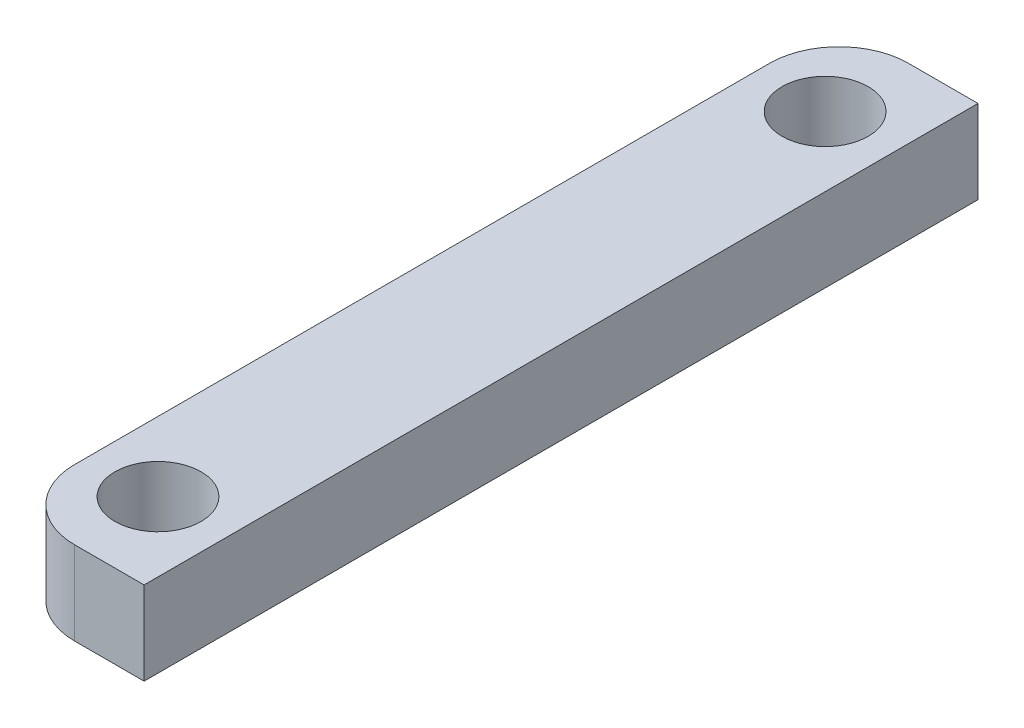
ISO-10303-21;
HEADER;
FILE_DESCRIPTION(('STEP AP214'),'2;1');
FILE_NAME('part.step','',(''),(''),'','','');
FILE_SCHEMA(('AUTOMOTIVE_DESIGN { 1 0 10303 214 1 1 1 1 }'));
ENDSEC;
DATA;
#1=APPLICATION_CONTEXT('core data for automotive mechanical design processes');
#2=APPLICATION_PROTOCOL_DEFINITION('international standard','automotive_design',2000,#1);
#3=PRODUCT_CONTEXT('',#1,'mechanical');
#4=PRODUCT('Part','Part','',(#3));
#5=PRODUCT_RELATED_PRODUCT_CATEGORY('part','',(#4));
#6=PRODUCT_DEFINITION_FORMATION('','',#4);
#7=PRODUCT_DEFINITION_CONTEXT('part definition',#1,'design');
#8=PRODUCT_DEFINITION('design','',#6,#7);
#9=PRODUCT_DEFINITION_SHAPE('','',#8);
#10=(LENGTH_UNIT() NAMED_UNIT(*) SI_UNIT(.MILLI.,.METRE.));
#11=(NAMED_UNIT(*) PLANE_ANGLE_UNIT() SI_UNIT($,.RADIAN.));
#12=(NAMED_UNIT(*) SI_UNIT($,.STERADIAN.) SOLID_ANGLE_UNIT());
#13=UNCERTAINTY_MEASURE_WITH_UNIT(LENGTH_MEASURE(1.E-05),#10,'distance_accuracy_value','');
#14=(GEOMETRIC_REPRESENTATION_CONTEXT(3) GLOBAL_UNCERTAINTY_ASSIGNED_CONTEXT((#13)) GLOBAL_UNIT_ASSIGNED_CONTEXT((#10,
#11,#12)) REPRESENTATION_CONTEXT('',''));
#15=CARTESIAN_POINT('',(0.,0.,0.));
#16=DIRECTION('',(0.,0.,1.));
#17=DIRECTION('',(1.,0.,0.));
#18=AXIS2_PLACEMENT_3D('',#15,#16,#17);
#19=CARTESIAN_POINT('',(0.,3.,0.));
#20=DIRECTION('',(0.,-1.,0.));
#21=DIRECTION('',(0.,0.,-1.));
#22=AXIS2_PLACEMENT_3D('',#19,#20,#21);
#23=PLANE('',#22);
#24=DIRECTION('',(0.,0.,1.));
#25=VECTOR('',#24,1.);
#26=CARTESIAN_POINT('',(-2.5,3.,15.));
#27=LINE('',#26,#25);
#28=CARTESIAN_POINT('',(-2.5,3.,-12.5));
#29=VERTEX_POINT('',#28);
#30=CARTESIAN_POINT('',(-2.5,3.,12.5));
#31=VERTEX_POINT('',#30);
#32=EDGE_CURVE('E93',#29,#31,#27,.T.);
#33=ORIENTED_EDGE('',*,*,#32,.T.);
#34=CARTESIAN_POINT('',(0.,3.,12.5));
#35=DIRECTION('',(0.,-1.,0.));
#36=DIRECTION('',(0.,0.,-1.));
#37=AXIS2_PLACEMENT_3D('',#34,#35,#36);
#38=CIRCLE('',#37,2.5);
#39=CARTESIAN_POINT('',(0.,3.,15.));
#40=VERTEX_POINT('',#39);
#41=EDGE_CURVE('E41',#31,#40,#38,.F.);
#42=ORIENTED_EDGE('',*,*,#41,.T.);
#43=DIRECTION('',(1.,0.,0.));
#44=VECTOR('',#43,1.);
#45=CARTESIAN_POINT('',(-2.5,3.,15.));
#46=LINE('',#45,#44);
#47=CARTESIAN_POINT('',(2.5,3.,15.));
#48=VERTEX_POINT('',#47);
#49=EDGE_CURVE('E99',#40,#48,#46,.T.);
#50=ORIENTED_EDGE('',*,*,#49,.T.);
#51=DIRECTION('',(0.,0.,-1.));
#52=VECTOR('',#51,1.);
#53=CARTESIAN_POINT('',(2.5,3.,15.));
#54=LINE('',#53,#52);
#55=CARTESIAN_POINT('',(2.5,3.,-15.));
#56=VERTEX_POINT('',#55);
#57=EDGE_CURVE('E94',#48,#56,#54,.T.);
#58=ORIENTED_EDGE('',*,*,#57,.T.);
#59=DIRECTION('',(-1.,0.,0.));
#60=VECTOR('',#59,1.);
#61=CARTESIAN_POINT('',(-2.5,3.,-15.));
#62=LINE('',#61,#60);
#63=CARTESIAN_POINT('',(0.,3.,-15.));
#64=VERTEX_POINT('',#63);
#65=EDGE_CURVE('E85',#56,#64,#62,.T.);
#66=ORIENTED_EDGE('',*,*,#65,.T.);
#67=CARTESIAN_POINT('',(0.,3.,-12.5));
#68=DIRECTION('',(0.,-1.,0.));
#69=DIRECTION('',(0.,0.,-1.));
#70=AXIS2_PLACEMENT_3D('',#67,#68,#69);
#71=CIRCLE('',#70,2.5);
#72=EDGE_CURVE('E124',#64,#29,#71,.F.);
#73=ORIENTED_EDGE('',*,*,#72,.T.);
#74=EDGE_LOOP('',(#33,#42,#50,#58,#66,#73));
#75=FACE_BOUND('',#74,.T.);
#76=CARTESIAN_POINT('',(0.,3.,-12.));
#77=DIRECTION('',(0.,1.,0.));
#78=DIRECTION('',(0.,0.,1.));
#79=AXIS2_PLACEMENT_3D('',#76,#77,#78);
#80=CIRCLE('',#79,1.55);
#81=CARTESIAN_POINT('',(0.,3.,-10.45));
#82=VERTEX_POINT('',#81);
#83=EDGE_CURVE('E144',#82,#82,#80,.T.);
#84=ORIENTED_EDGE('',*,*,#83,.F.);
#85=EDGE_LOOP('',(#84));
#86=FACE_BOUND('',#85,.T.);
#87=CARTESIAN_POINT('',(0.,3.,12.));
#88=DIRECTION('',(0.,1.,0.));
#89=DIRECTION('',(0.,0.,1.));
#90=AXIS2_PLACEMENT_3D('',#87,#88,#89);
#91=CIRCLE('',#90,1.55);
#92=CARTESIAN_POINT('',(0.,3.,13.55));
#93=VERTEX_POINT('',#92);
#94=EDGE_CURVE('E150',#93,#93,#91,.T.);
#95=ORIENTED_EDGE('',*,*,#94,.F.);
#96=EDGE_LOOP('',(#95));
#97=FACE_BOUND('',#96,.T.);
#98=ADVANCED_FACE('F33',(#75,#86,#97),#23,.F.);
#99=CARTESIAN_POINT('',(0.,0.,0.));
#100=DIRECTION('',(0.,-1.,0.));
#101=DIRECTION('',(0.,0.,-1.));
#102=AXIS2_PLACEMENT_3D('',#99,#100,#101);
#103=PLANE('',#102);
#104=CARTESIAN_POINT('',(0.,0.,-12.));
#105=DIRECTION('',(0.,1.,0.));
#106=DIRECTION('',(0.,0.,1.));
#107=AXIS2_PLACEMENT_3D('',#104,#105,#106);
#108=CIRCLE('',#107,1.55);
#109=CARTESIAN_POINT('',(0.,0.,-10.45));
#110=VERTEX_POINT('',#109);
#111=EDGE_CURVE('E147',#110,#110,#108,.T.);
#112=ORIENTED_EDGE('',*,*,#111,.T.);
#113=EDGE_LOOP('',(#112));
#114=FACE_BOUND('',#113,.T.);
#115=DIRECTION('',(1.,0.,0.));
#116=VECTOR('',#115,1.);
#117=CARTESIAN_POINT('',(-2.5,0.,15.));
#118=LINE('',#117,#116);
#119=CARTESIAN_POINT('',(0.,0.,15.));
#120=VERTEX_POINT('',#119);
#121=CARTESIAN_POINT('',(2.5,0.,15.));
#122=VERTEX_POINT('',#121);
#123=EDGE_CURVE('E103',#120,#122,#118,.T.);
#124=ORIENTED_EDGE('',*,*,#123,.F.);
#125=CARTESIAN_POINT('',(0.,0.,12.5));
#126=DIRECTION('',(0.,-1.,0.));
#127=DIRECTION('',(0.,0.,-1.));
#128=AXIS2_PLACEMENT_3D('',#125,#126,#127);
#129=CIRCLE('',#128,2.5);
#130=CARTESIAN_POINT('',(-2.5,0.,12.5));
#131=VERTEX_POINT('',#130);
#132=EDGE_CURVE('E118',#120,#131,#129,.T.);
#133=ORIENTED_EDGE('',*,*,#132,.T.);
#134=DIRECTION('',(0.,0.,1.));
#135=VECTOR('',#134,1.);
#136=CARTESIAN_POINT('',(-2.5,0.,15.));
#137=LINE('',#136,#135);
#138=CARTESIAN_POINT('',(-2.5,0.,-12.5));
#139=VERTEX_POINT('',#138);
#140=EDGE_CURVE('E137',#139,#131,#137,.T.);
#141=ORIENTED_EDGE('',*,*,#140,.F.);
#142=CARTESIAN_POINT('',(0.,0.,-12.5));
#143=DIRECTION('',(0.,-1.,0.));
#144=DIRECTION('',(0.,0.,-1.));
#145=AXIS2_PLACEMENT_3D('',#142,#143,#144);
#146=CIRCLE('',#145,2.5);
#147=CARTESIAN_POINT('',(0.,0.,-15.));
#148=VERTEX_POINT('',#147);
#149=EDGE_CURVE('E112',#139,#148,#146,.T.);
#150=ORIENTED_EDGE('',*,*,#149,.T.);
#151=DIRECTION('',(-1.,0.,0.));
#152=VECTOR('',#151,1.);
#153=CARTESIAN_POINT('',(-2.5,0.,-15.));
#154=LINE('',#153,#152);
#155=CARTESIAN_POINT('',(2.5,0.,-15.));
#156=VERTEX_POINT('',#155);
#157=EDGE_CURVE('E140',#156,#148,#154,.T.);
#158=ORIENTED_EDGE('',*,*,#157,.F.);
#159=DIRECTION('',(0.,0.,-1.));
#160=VECTOR('',#159,1.);
#161=CARTESIAN_POINT('',(2.5,0.,15.));
#162=LINE('',#161,#160);
#163=EDGE_CURVE('E107',#122,#156,#162,.T.);
#164=ORIENTED_EDGE('',*,*,#163,.F.);
#165=EDGE_LOOP('',(#124,#133,#141,#150,#158,#164));
#166=FACE_BOUND('',#165,.T.);
#167=CARTESIAN_POINT('',(0.,0.,12.));
#168=DIRECTION('',(0.,1.,0.));
#169=DIRECTION('',(0.,0.,1.));
#170=AXIS2_PLACEMENT_3D('',#167,#168,#169);
#171=CIRCLE('',#170,1.55);
#172=CARTESIAN_POINT('',(0.,0.,13.55));
#173=VERTEX_POINT('',#172);
#174=EDGE_CURVE('E153',#173,#173,#171,.T.);
#175=ORIENTED_EDGE('',*,*,#174,.T.);
#176=EDGE_LOOP('',(#175));
#177=FACE_BOUND('',#176,.T.);
#178=ADVANCED_FACE('F135',(#114,#166,#177),#103,.T.);
#179=CARTESIAN_POINT('',(2.5,3.,15.));
#180=DIRECTION('',(-1.,0.,0.));
#181=DIRECTION('',(0.,0.,1.));
#182=AXIS2_PLACEMENT_3D('',#179,#180,#181);
#183=PLANE('',#182);
#184=ORIENTED_EDGE('',*,*,#163,.T.);
#185=DIRECTION('',(0.,-1.,0.));
#186=VECTOR('',#185,1.);
#187=CARTESIAN_POINT('',(2.5,3.,-15.));
#188=LINE('',#187,#186);
#189=EDGE_CURVE('E89',#56,#156,#188,.T.);
#190=ORIENTED_EDGE('',*,*,#189,.F.);
#191=ORIENTED_EDGE('',*,*,#57,.F.);
#192=DIRECTION('',(0.,-1.,0.));
#193=VECTOR('',#192,1.);
#194=CARTESIAN_POINT('',(2.5,3.,15.));
#195=LINE('',#194,#193);
#196=EDGE_CURVE('E109',#48,#122,#195,.T.);
#197=ORIENTED_EDGE('',*,*,#196,.T.);
#198=EDGE_LOOP('',(#184,#190,#191,#197));
#199=FACE_BOUND('',#198,.T.);
#200=ADVANCED_FACE('F105',(#199),#183,.F.);
#201=CARTESIAN_POINT('',(-2.5,3.,-15.));
#202=DIRECTION('',(0.,0.,1.));
#203=DIRECTION('',(1.,0.,0.));
#204=AXIS2_PLACEMENT_3D('',#201,#202,#203);
#205=PLANE('',#204);
#206=ORIENTED_EDGE('',*,*,#157,.T.);
#207=DIRECTION('',(0.,-1.,0.));
#208=VECTOR('',#207,1.);
#209=CARTESIAN_POINT('',(0.,3.,-15.));
#210=LINE('',#209,#208);
#211=EDGE_CURVE('E11',#148,#64,#210,.F.);
#212=ORIENTED_EDGE('',*,*,#211,.T.);
#213=ORIENTED_EDGE('',*,*,#65,.F.);
#214=ORIENTED_EDGE('',*,*,#189,.T.);
#215=EDGE_LOOP('',(#206,#212,#213,#214));
#216=FACE_BOUND('',#215,.T.);
#217=ADVANCED_FACE('F87',(#216),#205,.F.);
#218=CARTESIAN_POINT('',(-2.5,3.,15.));
#219=DIRECTION('',(1.,0.,0.));
#220=DIRECTION('',(0.,0.,-1.));
#221=AXIS2_PLACEMENT_3D('',#218,#219,#220);
#222=PLANE('',#221);
#223=ORIENTED_EDGE('',*,*,#140,.T.);
#224=DIRECTION('',(0.,-1.,0.));
#225=VECTOR('',#224,1.);
#226=CARTESIAN_POINT('',(-2.5,3.,12.5));
#227=LINE('',#226,#225);
#228=EDGE_CURVE('E54',#131,#31,#227,.F.);
#229=ORIENTED_EDGE('',*,*,#228,.T.);
#230=ORIENTED_EDGE('',*,*,#32,.F.);
#231=DIRECTION('',(0.,-1.,0.));
#232=VECTOR('',#231,1.);
#233=CARTESIAN_POINT('',(-2.5,3.,-12.5));
#234=LINE('',#233,#232);
#235=EDGE_CURVE('E120',#29,#139,#234,.T.);
#236=ORIENTED_EDGE('',*,*,#235,.T.);
#237=EDGE_LOOP('',(#223,#229,#230,#236));
#238=FACE_BOUND('',#237,.T.);
#239=ADVANCED_FACE('F138',(#238),#222,.F.);
#240=CARTESIAN_POINT('',(-2.5,3.,15.));
#241=DIRECTION('',(0.,0.,-1.));
#242=DIRECTION('',(-1.,0.,0.));
#243=AXIS2_PLACEMENT_3D('',#240,#241,#242);
#244=PLANE('',#243);
#245=ORIENTED_EDGE('',*,*,#49,.F.);
#246=DIRECTION('',(0.,-1.,0.));
#247=VECTOR('',#246,1.);
#248=CARTESIAN_POINT('',(0.,3.,15.));
#249=LINE('',#248,#247);
#250=EDGE_CURVE('E108',#40,#120,#249,.T.);
#251=ORIENTED_EDGE('',*,*,#250,.T.);
#252=ORIENTED_EDGE('',*,*,#123,.T.);
#253=ORIENTED_EDGE('',*,*,#196,.F.);
#254=EDGE_LOOP('',(#245,#251,#252,#253));
#255=FACE_BOUND('',#254,.T.);
#256=ADVANCED_FACE('F129',(#255),#244,.F.);
#257=CARTESIAN_POINT('',(0.,3.,-12.));
#258=DIRECTION('',(0.,-1.,0.));
#259=DIRECTION('',(0.,0.,-1.));
#260=AXIS2_PLACEMENT_3D('',#257,#258,#259);
#261=CYLINDRICAL_SURFACE('',#260,1.55);
#262=ORIENTED_EDGE('',*,*,#83,.T.);
#263=EDGE_LOOP('',(#262));
#264=FACE_BOUND('',#263,.T.);
#265=ORIENTED_EDGE('',*,*,#111,.F.);
#266=EDGE_LOOP('',(#265));
#267=FACE_BOUND('',#266,.T.);
#268=ADVANCED_FACE('F171',(#264,#267),#261,.F.);
#269=CARTESIAN_POINT('',(0.,3.,12.));
#270=DIRECTION('',(0.,-1.,0.));
#271=DIRECTION('',(0.,0.,-1.));
#272=AXIS2_PLACEMENT_3D('',#269,#270,#271);
#273=CYLINDRICAL_SURFACE('',#272,1.55);
#274=ORIENTED_EDGE('',*,*,#94,.T.);
#275=EDGE_LOOP('',(#274));
#276=FACE_BOUND('',#275,.T.);
#277=ORIENTED_EDGE('',*,*,#174,.F.);
#278=EDGE_LOOP('',(#277));
#279=FACE_BOUND('',#278,.T.);
#280=ADVANCED_FACE('F159',(#276,#279),#273,.F.);
#281=CARTESIAN_POINT('',(0.,3.,12.5));
#282=DIRECTION('',(0.,-1.,0.));
#283=DIRECTION('',(0.,0.,-1.));
#284=AXIS2_PLACEMENT_3D('',#281,#282,#283);
#285=CYLINDRICAL_SURFACE('',#284,2.5);
#286=ORIENTED_EDGE('',*,*,#41,.F.);
#287=ORIENTED_EDGE('',*,*,#228,.F.);
#288=ORIENTED_EDGE('',*,*,#132,.F.);
#289=ORIENTED_EDGE('',*,*,#250,.F.);
#290=EDGE_LOOP('',(#286,#287,#288,#289));
#291=FACE_BOUND('',#290,.T.);
#292=ADVANCED_FACE('F132',(#291),#285,.T.);
#293=CARTESIAN_POINT('',(0.,3.,-12.5));
#294=DIRECTION('',(0.,-1.,0.));
#295=DIRECTION('',(0.,0.,-1.));
#296=AXIS2_PLACEMENT_3D('',#293,#294,#295);
#297=CYLINDRICAL_SURFACE('',#296,2.5);
#298=ORIENTED_EDGE('',*,*,#72,.F.);
#299=ORIENTED_EDGE('',*,*,#211,.F.);
#300=ORIENTED_EDGE('',*,*,#149,.F.);
#301=ORIENTED_EDGE('',*,*,#235,.F.);
#302=EDGE_LOOP('',(#298,#299,#300,#301));
#303=FACE_BOUND('',#302,.T.);
#304=ADVANCED_FACE('F35',(#303),#297,.T.);
#305=CLOSED_SHELL('',(#98,#178,#200,#217,#239,#256,#268,#280,#292,#304));
#306=MANIFOLD_SOLID_BREP('B2',#305);
#307=ADVANCED_BREP_SHAPE_REPRESENTATION('',(#18,#306),#14);
#308=SHAPE_DEFINITION_REPRESENTATION(#9,#307);
ENDSEC;
END-ISO-10303-21;
